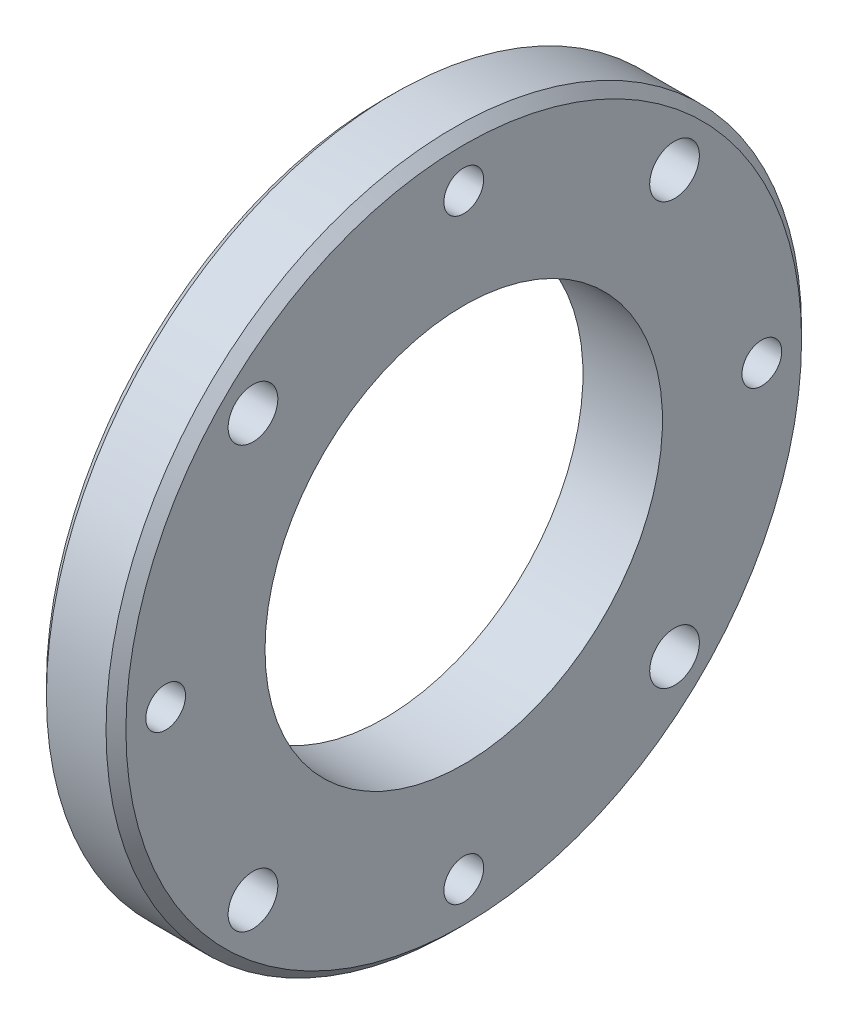
ISO-10303-21;
HEADER;
FILE_DESCRIPTION(('STEP AP214'),'2;1');
FILE_NAME('part.step','',(''),(''),'','','');
FILE_SCHEMA(('AUTOMOTIVE_DESIGN { 1 0 10303 214 1 1 1 1 }'));
ENDSEC;
DATA;
#1=APPLICATION_CONTEXT('core data for automotive mechanical design processes');
#2=APPLICATION_PROTOCOL_DEFINITION('international standard','automotive_design',2000,#1);
#3=PRODUCT_CONTEXT('',#1,'mechanical');
#4=PRODUCT('Part','Part','',(#3));
#5=PRODUCT_RELATED_PRODUCT_CATEGORY('part','',(#4));
#6=PRODUCT_DEFINITION_FORMATION('','',#4);
#7=PRODUCT_DEFINITION_CONTEXT('part definition',#1,'design');
#8=PRODUCT_DEFINITION('design','',#6,#7);
#9=PRODUCT_DEFINITION_SHAPE('','',#8);
#10=(LENGTH_UNIT() NAMED_UNIT(*) SI_UNIT(.MILLI.,.METRE.));
#11=(NAMED_UNIT(*) PLANE_ANGLE_UNIT() SI_UNIT($,.RADIAN.));
#12=(NAMED_UNIT(*) SI_UNIT($,.STERADIAN.) SOLID_ANGLE_UNIT());
#13=UNCERTAINTY_MEASURE_WITH_UNIT(LENGTH_MEASURE(1.E-05),#10,'distance_accuracy_value','');
#14=(GEOMETRIC_REPRESENTATION_CONTEXT(3) GLOBAL_UNCERTAINTY_ASSIGNED_CONTEXT((#13)) GLOBAL_UNIT_ASSIGNED_CONTEXT((#10,
#11,#12)) REPRESENTATION_CONTEXT('',''));
#15=CARTESIAN_POINT('',(0.,0.,0.));
#16=DIRECTION('',(0.,0.,1.));
#17=DIRECTION('',(1.,0.,0.));
#18=AXIS2_PLACEMENT_3D('',#15,#16,#17);
#19=CARTESIAN_POINT('',(0.,0.,0.));
#20=DIRECTION('',(-1.,0.,0.));
#21=DIRECTION('',(0.,0.,1.));
#22=AXIS2_PLACEMENT_3D('',#19,#20,#21);
#23=CYLINDRICAL_SURFACE('',#22,35.);
#24=CARTESIAN_POINT('',(1.00000000000002,0.,0.));
#25=DIRECTION('',(1.,0.,0.));
#26=DIRECTION('',(0.,0.,-1.));
#27=AXIS2_PLACEMENT_3D('',#24,#25,#26);
#28=CIRCLE('',#27,35.);
#29=CARTESIAN_POINT('',(1.00000000000002,0.,-35.));
#30=VERTEX_POINT('',#29);
#31=EDGE_CURVE('E36',#30,#30,#28,.T.);
#32=ORIENTED_EDGE('',*,*,#31,.T.);
#33=EDGE_LOOP('',(#32));
#34=FACE_BOUND('',#33,.T.);
#35=CARTESIAN_POINT('',(6.99999999999998,0.,0.));
#36=DIRECTION('',(-1.,0.,0.));
#37=DIRECTION('',(0.,0.,1.));
#38=AXIS2_PLACEMENT_3D('',#35,#36,#37);
#39=CIRCLE('',#38,35.);
#40=CARTESIAN_POINT('',(6.99999999999998,0.,35.));
#41=VERTEX_POINT('',#40);
#42=EDGE_CURVE('E40',#41,#41,#39,.T.);
#43=ORIENTED_EDGE('',*,*,#42,.T.);
#44=EDGE_LOOP('',(#43));
#45=FACE_BOUND('',#44,.T.);
#46=ADVANCED_FACE('F30',(#34,#45),#23,.T.);
#47=CARTESIAN_POINT('',(0.,35.,0.));
#48=DIRECTION('',(1.,0.,0.));
#49=DIRECTION('',(0.,0.,-1.));
#50=AXIS2_PLACEMENT_3D('',#47,#48,#49);
#51=PLANE('',#50);
#52=CARTESIAN_POINT('',(0.,21.2132034355967,-21.2132034355962));
#53=DIRECTION('',(-1.,0.,0.));
#54=DIRECTION('',(0.,0.,1.));
#55=AXIS2_PLACEMENT_3D('',#52,#53,#54);
#56=CIRCLE('',#55,2.5);
#57=CARTESIAN_POINT('',(0.,21.2132034355967,-18.7132034355962));
#58=VERTEX_POINT('',#57);
#59=EDGE_CURVE('E100',#58,#58,#56,.T.);
#60=ORIENTED_EDGE('',*,*,#59,.F.);
#61=EDGE_LOOP('',(#60));
#62=FACE_BOUND('',#61,.T.);
#63=CARTESIAN_POINT('',(0.,3.14233502499845E-13,-30.));
#64=DIRECTION('',(-1.,0.,0.));
#65=DIRECTION('',(0.,0.,1.));
#66=AXIS2_PLACEMENT_3D('',#63,#64,#65);
#67=CIRCLE('',#66,2.);
#68=CARTESIAN_POINT('',(0.,3.14233502499845E-13,-28.));
#69=VERTEX_POINT('',#68);
#70=EDGE_CURVE('E94',#69,#69,#67,.T.);
#71=ORIENTED_EDGE('',*,*,#70,.F.);
#72=EDGE_LOOP('',(#71));
#73=FACE_BOUND('',#72,.T.);
#74=CARTESIAN_POINT('',(0.,-21.2132034355962,-21.2132034355966));
#75=DIRECTION('',(-1.,0.,0.));
#76=DIRECTION('',(0.,0.,1.));
#77=AXIS2_PLACEMENT_3D('',#74,#75,#76);
#78=CIRCLE('',#77,2.5);
#79=CARTESIAN_POINT('',(0.,-21.2132034355962,-18.7132034355966));
#80=VERTEX_POINT('',#79);
#81=EDGE_CURVE('E88',#80,#80,#78,.T.);
#82=ORIENTED_EDGE('',*,*,#81,.F.);
#83=EDGE_LOOP('',(#82));
#84=FACE_BOUND('',#83,.T.);
#85=CARTESIAN_POINT('',(0.,-30.,-2.09489001666563E-13));
#86=DIRECTION('',(-1.,0.,0.));
#87=DIRECTION('',(0.,0.,1.));
#88=AXIS2_PLACEMENT_3D('',#85,#86,#87);
#89=CIRCLE('',#88,2.);
#90=CARTESIAN_POINT('',(0.,-30.,1.99999999999979));
#91=VERTEX_POINT('',#90);
#92=EDGE_CURVE('E82',#91,#91,#89,.T.);
#93=ORIENTED_EDGE('',*,*,#92,.F.);
#94=EDGE_LOOP('',(#93));
#95=FACE_BOUND('',#94,.T.);
#96=CARTESIAN_POINT('',(0.,-21.2132034355965,21.2132034355963));
#97=DIRECTION('',(-1.,0.,0.));
#98=DIRECTION('',(0.,0.,1.));
#99=AXIS2_PLACEMENT_3D('',#96,#97,#98);
#100=CIRCLE('',#99,2.5);
#101=CARTESIAN_POINT('',(0.,-21.2132034355965,23.7132034355963));
#102=VERTEX_POINT('',#101);
#103=EDGE_CURVE('E76',#102,#102,#100,.T.);
#104=ORIENTED_EDGE('',*,*,#103,.F.);
#105=EDGE_LOOP('',(#104));
#106=FACE_BOUND('',#105,.T.);
#107=CARTESIAN_POINT('',(0.,-1.04744500833282E-13,30.));
#108=DIRECTION('',(-1.,0.,0.));
#109=DIRECTION('',(0.,0.,1.));
#110=AXIS2_PLACEMENT_3D('',#107,#108,#109);
#111=CIRCLE('',#110,2.);
#112=CARTESIAN_POINT('',(0.,-1.04744500833282E-13,32.));
#113=VERTEX_POINT('',#112);
#114=EDGE_CURVE('E70',#113,#113,#111,.T.);
#115=ORIENTED_EDGE('',*,*,#114,.F.);
#116=EDGE_LOOP('',(#115));
#117=FACE_BOUND('',#116,.T.);
#118=CARTESIAN_POINT('',(0.,21.2132034355964,21.2132034355965));
#119=DIRECTION('',(-1.,0.,0.));
#120=DIRECTION('',(0.,0.,1.));
#121=AXIS2_PLACEMENT_3D('',#118,#119,#120);
#122=CIRCLE('',#121,2.5);
#123=CARTESIAN_POINT('',(0.,21.2132034355964,23.7132034355965));
#124=VERTEX_POINT('',#123);
#125=EDGE_CURVE('E64',#124,#124,#122,.T.);
#126=ORIENTED_EDGE('',*,*,#125,.F.);
#127=EDGE_LOOP('',(#126));
#128=FACE_BOUND('',#127,.T.);
#129=CARTESIAN_POINT('',(0.,30.,0.));
#130=DIRECTION('',(-1.,0.,0.));
#131=DIRECTION('',(0.,0.,1.));
#132=AXIS2_PLACEMENT_3D('',#129,#130,#131);
#133=CIRCLE('',#132,2.);
#134=CARTESIAN_POINT('',(0.,30.,2.));
#135=VERTEX_POINT('',#134);
#136=EDGE_CURVE('E58',#135,#135,#133,.T.);
#137=ORIENTED_EDGE('',*,*,#136,.F.);
#138=EDGE_LOOP('',(#137));
#139=FACE_BOUND('',#138,.T.);
#140=CARTESIAN_POINT('',(0.,0.,0.));
#141=DIRECTION('',(1.,0.,0.));
#142=DIRECTION('',(0.,0.,-1.));
#143=AXIS2_PLACEMENT_3D('',#140,#141,#142);
#144=CIRCLE('',#143,34.);
#145=CARTESIAN_POINT('',(0.,0.,-34.));
#146=VERTEX_POINT('',#145);
#147=EDGE_CURVE('E44',#146,#146,#144,.F.);
#148=ORIENTED_EDGE('',*,*,#147,.T.);
#149=EDGE_LOOP('',(#148));
#150=FACE_BOUND('',#149,.T.);
#151=CARTESIAN_POINT('',(0.,0.,0.));
#152=DIRECTION('',(-1.,0.,0.));
#153=DIRECTION('',(0.,0.,1.));
#154=AXIS2_PLACEMENT_3D('',#151,#152,#153);
#155=CIRCLE('',#154,20.);
#156=CARTESIAN_POINT('',(0.,0.,20.));
#157=VERTEX_POINT('',#156);
#158=EDGE_CURVE('E49',#157,#157,#155,.T.);
#159=ORIENTED_EDGE('',*,*,#158,.F.);
#160=EDGE_LOOP('',(#159));
#161=FACE_BOUND('',#160,.T.);
#162=ADVANCED_FACE('F106',(#62,#73,#84,#95,#106,#117,#128,#139,#150,#161),#51,.F.);
#163=CARTESIAN_POINT('',(0.,0.,0.));
#164=DIRECTION('',(-1.,0.,0.));
#165=DIRECTION('',(0.,0.,1.));
#166=AXIS2_PLACEMENT_3D('',#163,#164,#165);
#167=CYLINDRICAL_SURFACE('',#166,20.);
#168=CARTESIAN_POINT('',(8.,0.,0.));
#169=DIRECTION('',(-1.,0.,0.));
#170=DIRECTION('',(0.,0.,1.));
#171=AXIS2_PLACEMENT_3D('',#168,#169,#170);
#172=CIRCLE('',#171,20.);
#173=CARTESIAN_POINT('',(8.,0.,20.));
#174=VERTEX_POINT('',#173);
#175=EDGE_CURVE('E52',#174,#174,#172,.T.);
#176=ORIENTED_EDGE('',*,*,#175,.F.);
#177=EDGE_LOOP('',(#176));
#178=FACE_BOUND('',#177,.T.);
#179=ORIENTED_EDGE('',*,*,#158,.T.);
#180=EDGE_LOOP('',(#179));
#181=FACE_BOUND('',#180,.T.);
#182=ADVANCED_FACE('F109',(#178,#181),#167,.F.);
#183=CARTESIAN_POINT('',(8.,20.,0.));
#184=DIRECTION('',(-1.,0.,0.));
#185=DIRECTION('',(0.,0.,1.));
#186=AXIS2_PLACEMENT_3D('',#183,#184,#185);
#187=PLANE('',#186);
#188=CARTESIAN_POINT('',(8.,21.2132034355967,-21.2132034355962));
#189=DIRECTION('',(-1.,0.,0.));
#190=DIRECTION('',(0.,0.,1.));
#191=AXIS2_PLACEMENT_3D('',#188,#189,#190);
#192=CIRCLE('',#191,2.5);
#193=CARTESIAN_POINT('',(8.,21.2132034355967,-18.7132034355962));
#194=VERTEX_POINT('',#193);
#195=EDGE_CURVE('E97',#194,#194,#192,.T.);
#196=ORIENTED_EDGE('',*,*,#195,.T.);
#197=EDGE_LOOP('',(#196));
#198=FACE_BOUND('',#197,.T.);
#199=CARTESIAN_POINT('',(8.,3.14233502499845E-13,-30.));
#200=DIRECTION('',(-1.,0.,0.));
#201=DIRECTION('',(0.,0.,1.));
#202=AXIS2_PLACEMENT_3D('',#199,#200,#201);
#203=CIRCLE('',#202,2.);
#204=CARTESIAN_POINT('',(8.,3.14233502499845E-13,-28.));
#205=VERTEX_POINT('',#204);
#206=EDGE_CURVE('E91',#205,#205,#203,.T.);
#207=ORIENTED_EDGE('',*,*,#206,.T.);
#208=EDGE_LOOP('',(#207));
#209=FACE_BOUND('',#208,.T.);
#210=CARTESIAN_POINT('',(8.,-21.2132034355962,-21.2132034355966));
#211=DIRECTION('',(-1.,0.,0.));
#212=DIRECTION('',(0.,0.,1.));
#213=AXIS2_PLACEMENT_3D('',#210,#211,#212);
#214=CIRCLE('',#213,2.5);
#215=CARTESIAN_POINT('',(8.,-21.2132034355962,-18.7132034355966));
#216=VERTEX_POINT('',#215);
#217=EDGE_CURVE('E85',#216,#216,#214,.T.);
#218=ORIENTED_EDGE('',*,*,#217,.T.);
#219=EDGE_LOOP('',(#218));
#220=FACE_BOUND('',#219,.T.);
#221=CARTESIAN_POINT('',(8.,-30.,-2.09489001666563E-13));
#222=DIRECTION('',(-1.,0.,0.));
#223=DIRECTION('',(0.,0.,1.));
#224=AXIS2_PLACEMENT_3D('',#221,#222,#223);
#225=CIRCLE('',#224,2.);
#226=CARTESIAN_POINT('',(8.,-30.,1.99999999999979));
#227=VERTEX_POINT('',#226);
#228=EDGE_CURVE('E79',#227,#227,#225,.T.);
#229=ORIENTED_EDGE('',*,*,#228,.T.);
#230=EDGE_LOOP('',(#229));
#231=FACE_BOUND('',#230,.T.);
#232=CARTESIAN_POINT('',(8.,-21.2132034355965,21.2132034355963));
#233=DIRECTION('',(-1.,0.,0.));
#234=DIRECTION('',(0.,0.,1.));
#235=AXIS2_PLACEMENT_3D('',#232,#233,#234);
#236=CIRCLE('',#235,2.5);
#237=CARTESIAN_POINT('',(8.,-21.2132034355965,23.7132034355963));
#238=VERTEX_POINT('',#237);
#239=EDGE_CURVE('E73',#238,#238,#236,.T.);
#240=ORIENTED_EDGE('',*,*,#239,.T.);
#241=EDGE_LOOP('',(#240));
#242=FACE_BOUND('',#241,.T.);
#243=CARTESIAN_POINT('',(8.,-1.04744500833282E-13,30.));
#244=DIRECTION('',(-1.,0.,0.));
#245=DIRECTION('',(0.,0.,1.));
#246=AXIS2_PLACEMENT_3D('',#243,#244,#245);
#247=CIRCLE('',#246,2.);
#248=CARTESIAN_POINT('',(8.,-1.04744500833282E-13,32.));
#249=VERTEX_POINT('',#248);
#250=EDGE_CURVE('E67',#249,#249,#247,.T.);
#251=ORIENTED_EDGE('',*,*,#250,.T.);
#252=EDGE_LOOP('',(#251));
#253=FACE_BOUND('',#252,.T.);
#254=CARTESIAN_POINT('',(8.,21.2132034355964,21.2132034355965));
#255=DIRECTION('',(-1.,0.,0.));
#256=DIRECTION('',(0.,0.,1.));
#257=AXIS2_PLACEMENT_3D('',#254,#255,#256);
#258=CIRCLE('',#257,2.5);
#259=CARTESIAN_POINT('',(8.,21.2132034355964,23.7132034355965));
#260=VERTEX_POINT('',#259);
#261=EDGE_CURVE('E61',#260,#260,#258,.T.);
#262=ORIENTED_EDGE('',*,*,#261,.T.);
#263=EDGE_LOOP('',(#262));
#264=FACE_BOUND('',#263,.T.);
#265=CARTESIAN_POINT('',(8.,30.,0.));
#266=DIRECTION('',(-1.,0.,0.));
#267=DIRECTION('',(0.,0.,1.));
#268=AXIS2_PLACEMENT_3D('',#265,#266,#267);
#269=CIRCLE('',#268,2.);
#270=CARTESIAN_POINT('',(8.,30.,2.));
#271=VERTEX_POINT('',#270);
#272=EDGE_CURVE('E55',#271,#271,#269,.T.);
#273=ORIENTED_EDGE('',*,*,#272,.T.);
#274=EDGE_LOOP('',(#273));
#275=FACE_BOUND('',#274,.T.);
#276=CARTESIAN_POINT('',(8.,0.,0.));
#277=DIRECTION('',(-1.,0.,0.));
#278=DIRECTION('',(0.,0.,1.));
#279=AXIS2_PLACEMENT_3D('',#276,#277,#278);
#280=CIRCLE('',#279,34.);
#281=CARTESIAN_POINT('',(8.,0.,34.));
#282=VERTEX_POINT('',#281);
#283=EDGE_CURVE('E10',#282,#282,#280,.F.);
#284=ORIENTED_EDGE('',*,*,#283,.T.);
#285=EDGE_LOOP('',(#284));
#286=FACE_BOUND('',#285,.T.);
#287=ORIENTED_EDGE('',*,*,#175,.T.);
#288=EDGE_LOOP('',(#287));
#289=FACE_BOUND('',#288,.T.);
#290=ADVANCED_FACE('F129',(#198,#209,#220,#231,#242,#253,#264,#275,#286,#289),#187,.F.);
#291=CARTESIAN_POINT('',(0.,0.,0.));
#292=DIRECTION('',(1.,0.,0.));
#293=DIRECTION('',(0.,0.,-1.));
#294=AXIS2_PLACEMENT_3D('',#291,#292,#293);
#295=CONICAL_SURFACE('',#294,34.,0.785398163397443);
#296=ORIENTED_EDGE('',*,*,#31,.F.);
#297=EDGE_LOOP('',(#296));
#298=FACE_BOUND('',#297,.T.);
#299=ORIENTED_EDGE('',*,*,#147,.F.);
#300=EDGE_LOOP('',(#299));
#301=FACE_BOUND('',#300,.T.);
#302=ADVANCED_FACE('F135',(#298,#301),#295,.T.);
#303=CARTESIAN_POINT('',(6.99999999999998,0.,0.));
#304=DIRECTION('',(-1.,0.,0.));
#305=DIRECTION('',(0.,0.,1.));
#306=AXIS2_PLACEMENT_3D('',#303,#304,#305);
#307=CONICAL_SURFACE('',#306,35.,0.785398163397444);
#308=ORIENTED_EDGE('',*,*,#283,.F.);
#309=EDGE_LOOP('',(#308));
#310=FACE_BOUND('',#309,.T.);
#311=ORIENTED_EDGE('',*,*,#42,.F.);
#312=EDGE_LOOP('',(#311));
#313=FACE_BOUND('',#312,.T.);
#314=ADVANCED_FACE('F145',(#310,#313),#307,.T.);
#315=CARTESIAN_POINT('',(8.,30.,0.));
#316=DIRECTION('',(-1.,0.,0.));
#317=DIRECTION('',(0.,0.,1.));
#318=AXIS2_PLACEMENT_3D('',#315,#316,#317);
#319=CYLINDRICAL_SURFACE('',#318,2.);
#320=ORIENTED_EDGE('',*,*,#272,.F.);
#321=EDGE_LOOP('',(#320));
#322=FACE_BOUND('',#321,.T.);
#323=ORIENTED_EDGE('',*,*,#136,.T.);
#324=EDGE_LOOP('',(#323));
#325=FACE_BOUND('',#324,.T.);
#326=ADVANCED_FACE('F147',(#322,#325),#319,.F.);
#327=CARTESIAN_POINT('',(8.,21.2132034355964,21.2132034355965));
#328=DIRECTION('',(-1.,0.,0.));
#329=DIRECTION('',(0.,0.,1.));
#330=AXIS2_PLACEMENT_3D('',#327,#328,#329);
#331=CYLINDRICAL_SURFACE('',#330,2.5);
#332=ORIENTED_EDGE('',*,*,#261,.F.);
#333=EDGE_LOOP('',(#332));
#334=FACE_BOUND('',#333,.T.);
#335=ORIENTED_EDGE('',*,*,#125,.T.);
#336=EDGE_LOOP('',(#335));
#337=FACE_BOUND('',#336,.T.);
#338=ADVANCED_FACE('F154',(#334,#337),#331,.F.);
#339=CARTESIAN_POINT('',(8.,-1.04744500833282E-13,30.));
#340=DIRECTION('',(-1.,0.,0.));
#341=DIRECTION('',(0.,0.,1.));
#342=AXIS2_PLACEMENT_3D('',#339,#340,#341);
#343=CYLINDRICAL_SURFACE('',#342,2.);
#344=ORIENTED_EDGE('',*,*,#250,.F.);
#345=EDGE_LOOP('',(#344));
#346=FACE_BOUND('',#345,.T.);
#347=ORIENTED_EDGE('',*,*,#114,.T.);
#348=EDGE_LOOP('',(#347));
#349=FACE_BOUND('',#348,.T.);
#350=ADVANCED_FACE('F162',(#346,#349),#343,.F.);
#351=CARTESIAN_POINT('',(8.,-21.2132034355965,21.2132034355963));
#352=DIRECTION('',(-1.,0.,0.));
#353=DIRECTION('',(0.,0.,1.));
#354=AXIS2_PLACEMENT_3D('',#351,#352,#353);
#355=CYLINDRICAL_SURFACE('',#354,2.5);
#356=ORIENTED_EDGE('',*,*,#239,.F.);
#357=EDGE_LOOP('',(#356));
#358=FACE_BOUND('',#357,.T.);
#359=ORIENTED_EDGE('',*,*,#103,.T.);
#360=EDGE_LOOP('',(#359));
#361=FACE_BOUND('',#360,.T.);
#362=ADVANCED_FACE('F166',(#358,#361),#355,.F.);
#363=CARTESIAN_POINT('',(8.,-30.,-2.09489001666563E-13));
#364=DIRECTION('',(-1.,0.,0.));
#365=DIRECTION('',(0.,0.,1.));
#366=AXIS2_PLACEMENT_3D('',#363,#364,#365);
#367=CYLINDRICAL_SURFACE('',#366,2.);
#368=ORIENTED_EDGE('',*,*,#228,.F.);
#369=EDGE_LOOP('',(#368));
#370=FACE_BOUND('',#369,.T.);
#371=ORIENTED_EDGE('',*,*,#92,.T.);
#372=EDGE_LOOP('',(#371));
#373=FACE_BOUND('',#372,.T.);
#374=ADVANCED_FACE('F170',(#370,#373),#367,.F.);
#375=CARTESIAN_POINT('',(8.,-21.2132034355962,-21.2132034355966));
#376=DIRECTION('',(-1.,0.,0.));
#377=DIRECTION('',(0.,0.,1.));
#378=AXIS2_PLACEMENT_3D('',#375,#376,#377);
#379=CYLINDRICAL_SURFACE('',#378,2.5);
#380=ORIENTED_EDGE('',*,*,#217,.F.);
#381=EDGE_LOOP('',(#380));
#382=FACE_BOUND('',#381,.T.);
#383=ORIENTED_EDGE('',*,*,#81,.T.);
#384=EDGE_LOOP('',(#383));
#385=FACE_BOUND('',#384,.T.);
#386=ADVANCED_FACE('F174',(#382,#385),#379,.F.);
#387=CARTESIAN_POINT('',(8.,3.14233502499845E-13,-30.));
#388=DIRECTION('',(-1.,0.,0.));
#389=DIRECTION('',(0.,0.,1.));
#390=AXIS2_PLACEMENT_3D('',#387,#388,#389);
#391=CYLINDRICAL_SURFACE('',#390,2.);
#392=ORIENTED_EDGE('',*,*,#206,.F.);
#393=EDGE_LOOP('',(#392));
#394=FACE_BOUND('',#393,.T.);
#395=ORIENTED_EDGE('',*,*,#70,.T.);
#396=EDGE_LOOP('',(#395));
#397=FACE_BOUND('',#396,.T.);
#398=ADVANCED_FACE('F178',(#394,#397),#391,.F.);
#399=CARTESIAN_POINT('',(8.,21.2132034355967,-21.2132034355962));
#400=DIRECTION('',(-1.,0.,0.));
#401=DIRECTION('',(0.,0.,1.));
#402=AXIS2_PLACEMENT_3D('',#399,#400,#401);
#403=CYLINDRICAL_SURFACE('',#402,2.5);
#404=ORIENTED_EDGE('',*,*,#195,.F.);
#405=EDGE_LOOP('',(#404));
#406=FACE_BOUND('',#405,.T.);
#407=ORIENTED_EDGE('',*,*,#59,.T.);
#408=EDGE_LOOP('',(#407));
#409=FACE_BOUND('',#408,.T.);
#410=ADVANCED_FACE('F104',(#406,#409),#403,.F.);
#411=CLOSED_SHELL('',(#46,#162,#182,#290,#302,#314,#326,#338,#350,#362,#374,#386,#398,#410));
#412=MANIFOLD_SOLID_BREP('B2',#411);
#413=ADVANCED_BREP_SHAPE_REPRESENTATION('',(#18,#412),#14);
#414=SHAPE_DEFINITION_REPRESENTATION(#9,#413);
ENDSEC;
END-ISO-10303-21;
